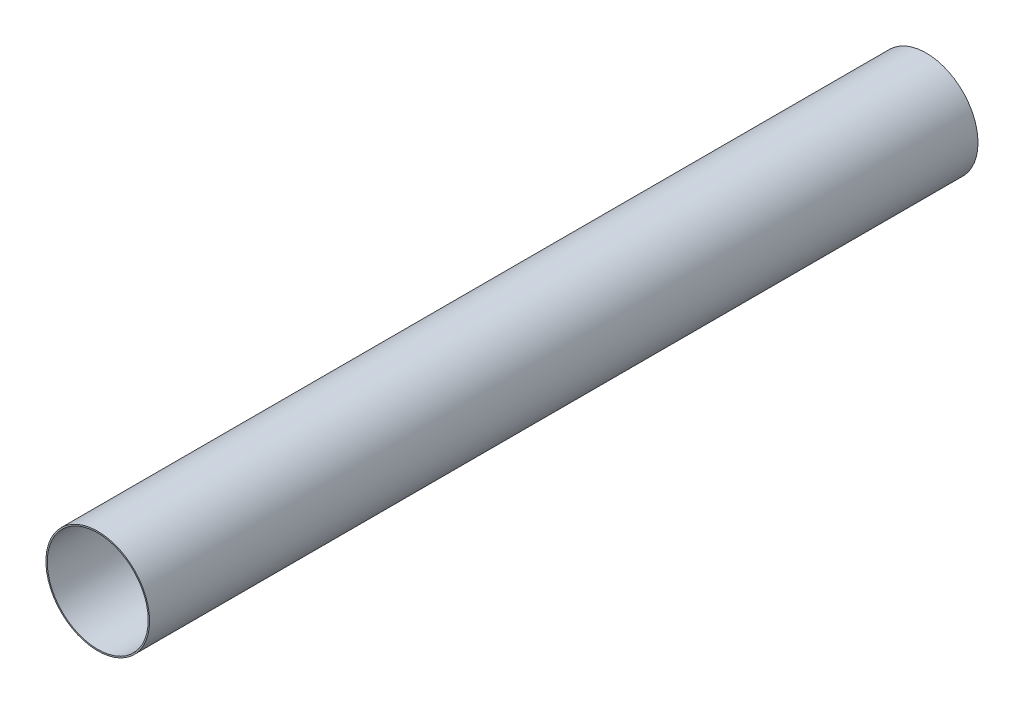
ISO-10303-21;
HEADER;
FILE_DESCRIPTION(('STEP AP214'),'2;1');
FILE_NAME('part.step','',(''),(''),'','','');
FILE_SCHEMA(('AUTOMOTIVE_DESIGN { 1 0 10303 214 1 1 1 1 }'));
ENDSEC;
DATA;
#1=APPLICATION_CONTEXT('core data for automotive mechanical design processes');
#2=APPLICATION_PROTOCOL_DEFINITION('international standard','automotive_design',2000,#1);
#3=PRODUCT_CONTEXT('',#1,'mechanical');
#4=PRODUCT('Part','Part','',(#3));
#5=PRODUCT_RELATED_PRODUCT_CATEGORY('part','',(#4));
#6=PRODUCT_DEFINITION_FORMATION('','',#4);
#7=PRODUCT_DEFINITION_CONTEXT('part definition',#1,'design');
#8=PRODUCT_DEFINITION('design','',#6,#7);
#9=PRODUCT_DEFINITION_SHAPE('','',#8);
#10=(LENGTH_UNIT() NAMED_UNIT(*) SI_UNIT(.MILLI.,.METRE.));
#11=(NAMED_UNIT(*) PLANE_ANGLE_UNIT() SI_UNIT($,.RADIAN.));
#12=(NAMED_UNIT(*) SI_UNIT($,.STERADIAN.) SOLID_ANGLE_UNIT());
#13=UNCERTAINTY_MEASURE_WITH_UNIT(LENGTH_MEASURE(1.E-05),#10,'distance_accuracy_value','');
#14=(GEOMETRIC_REPRESENTATION_CONTEXT(3) GLOBAL_UNCERTAINTY_ASSIGNED_CONTEXT((#13)) GLOBAL_UNIT_ASSIGNED_CONTEXT((#10,
#11,#12)) REPRESENTATION_CONTEXT('',''));
#15=CARTESIAN_POINT('',(0.,0.,0.));
#16=DIRECTION('',(0.,0.,1.));
#17=DIRECTION('',(1.,0.,0.));
#18=AXIS2_PLACEMENT_3D('',#15,#16,#17);
#19=CARTESIAN_POINT('',(0.,0.,1250.));
#20=DIRECTION('',(0.,0.,1.));
#21=DIRECTION('',(1.,0.,0.));
#22=AXIS2_PLACEMENT_3D('',#19,#20,#21);
#23=PLANE('',#22);
#24=CARTESIAN_POINT('',(0.,0.,1250.));
#25=DIRECTION('',(0.,0.,1.));
#26=DIRECTION('',(1.,0.,0.));
#27=AXIS2_PLACEMENT_3D('',#24,#25,#26);
#28=CIRCLE('',#27,78.2);
#29=CARTESIAN_POINT('',(78.2,0.,1250.));
#30=VERTEX_POINT('',#29);
#31=EDGE_CURVE('E10',#30,#30,#28,.T.);
#32=ORIENTED_EDGE('',*,*,#31,.T.);
#33=EDGE_LOOP('',(#32));
#34=FACE_BOUND('',#33,.T.);
#35=CARTESIAN_POINT('',(0.,0.,1250.));
#36=DIRECTION('',(0.,0.,1.));
#37=DIRECTION('',(1.,0.,0.));
#38=AXIS2_PLACEMENT_3D('',#35,#36,#37);
#39=CIRCLE('',#38,76.2);
#40=CARTESIAN_POINT('',(76.2,0.,1250.));
#41=VERTEX_POINT('',#40);
#42=EDGE_CURVE('E44',#41,#41,#39,.T.);
#43=ORIENTED_EDGE('',*,*,#42,.F.);
#44=EDGE_LOOP('',(#43));
#45=FACE_BOUND('',#44,.T.);
#46=ADVANCED_FACE('F33',(#34,#45),#23,.T.);
#47=CARTESIAN_POINT('',(0.,0.,0.));
#48=DIRECTION('',(0.,0.,1.));
#49=DIRECTION('',(1.,0.,0.));
#50=AXIS2_PLACEMENT_3D('',#47,#48,#49);
#51=PLANE('',#50);
#52=CARTESIAN_POINT('',(0.,0.,0.));
#53=DIRECTION('',(0.,0.,1.));
#54=DIRECTION('',(1.,0.,0.));
#55=AXIS2_PLACEMENT_3D('',#52,#53,#54);
#56=CIRCLE('',#55,78.2);
#57=CARTESIAN_POINT('',(78.2,0.,0.));
#58=VERTEX_POINT('',#57);
#59=EDGE_CURVE('E37',#58,#58,#56,.T.);
#60=ORIENTED_EDGE('',*,*,#59,.F.);
#61=EDGE_LOOP('',(#60));
#62=FACE_BOUND('',#61,.T.);
#63=CARTESIAN_POINT('',(0.,0.,0.));
#64=DIRECTION('',(0.,0.,1.));
#65=DIRECTION('',(1.,0.,0.));
#66=AXIS2_PLACEMENT_3D('',#63,#64,#65);
#67=CIRCLE('',#66,76.2);
#68=CARTESIAN_POINT('',(76.2,0.,0.));
#69=VERTEX_POINT('',#68);
#70=EDGE_CURVE('E46',#69,#69,#67,.T.);
#71=ORIENTED_EDGE('',*,*,#70,.T.);
#72=EDGE_LOOP('',(#71));
#73=FACE_BOUND('',#72,.T.);
#74=ADVANCED_FACE('F56',(#62,#73),#51,.F.);
#75=CARTESIAN_POINT('',(0.,0.,1250.));
#76=DIRECTION('',(0.,0.,-1.));
#77=DIRECTION('',(-1.,0.,0.));
#78=AXIS2_PLACEMENT_3D('',#75,#76,#77);
#79=CYLINDRICAL_SURFACE('',#78,78.2);
#80=ORIENTED_EDGE('',*,*,#31,.F.);
#81=EDGE_LOOP('',(#80));
#82=FACE_BOUND('',#81,.T.);
#83=ORIENTED_EDGE('',*,*,#59,.T.);
#84=EDGE_LOOP('',(#83));
#85=FACE_BOUND('',#84,.T.);
#86=ADVANCED_FACE('F35',(#82,#85),#79,.T.);
#87=CARTESIAN_POINT('',(0.,0.,1250.));
#88=DIRECTION('',(0.,0.,-1.));
#89=DIRECTION('',(-1.,0.,0.));
#90=AXIS2_PLACEMENT_3D('',#87,#88,#89);
#91=CYLINDRICAL_SURFACE('',#90,76.2);
#92=ORIENTED_EDGE('',*,*,#42,.T.);
#93=EDGE_LOOP('',(#92));
#94=FACE_BOUND('',#93,.T.);
#95=ORIENTED_EDGE('',*,*,#70,.F.);
#96=EDGE_LOOP('',(#95));
#97=FACE_BOUND('',#96,.T.);
#98=ADVANCED_FACE('F52',(#94,#97),#91,.F.);
#99=CLOSED_SHELL('',(#46,#74,#86,#98));
#100=MANIFOLD_SOLID_BREP('B2',#99);
#101=ADVANCED_BREP_SHAPE_REPRESENTATION('',(#18,#100),#14);
#102=SHAPE_DEFINITION_REPRESENTATION(#9,#101);
ENDSEC;
END-ISO-10303-21;
